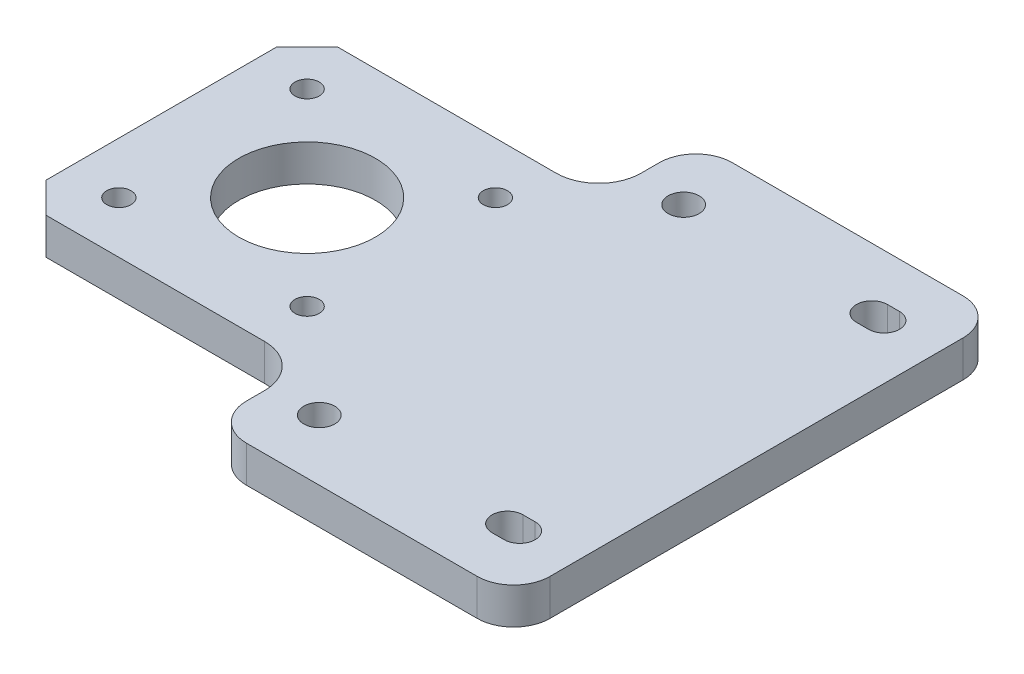
ISO-10303-21;
HEADER;
FILE_DESCRIPTION(('STEP AP214'),'2;1');
FILE_NAME('part.step','',(''),(''),'','','');
FILE_SCHEMA(('AUTOMOTIVE_DESIGN { 1 0 10303 214 1 1 1 1 }'));
ENDSEC;
DATA;
#1=APPLICATION_CONTEXT('core data for automotive mechanical design processes');
#2=APPLICATION_PROTOCOL_DEFINITION('international standard','automotive_design',2000,#1);
#3=PRODUCT_CONTEXT('',#1,'mechanical');
#4=PRODUCT('Part','Part','',(#3));
#5=PRODUCT_RELATED_PRODUCT_CATEGORY('part','',(#4));
#6=PRODUCT_DEFINITION_FORMATION('','',#4);
#7=PRODUCT_DEFINITION_CONTEXT('part definition',#1,'design');
#8=PRODUCT_DEFINITION('design','',#6,#7);
#9=PRODUCT_DEFINITION_SHAPE('','',#8);
#10=(LENGTH_UNIT() NAMED_UNIT(*) SI_UNIT(.MILLI.,.METRE.));
#11=(NAMED_UNIT(*) PLANE_ANGLE_UNIT() SI_UNIT($,.RADIAN.));
#12=(NAMED_UNIT(*) SI_UNIT($,.STERADIAN.) SOLID_ANGLE_UNIT());
#13=UNCERTAINTY_MEASURE_WITH_UNIT(LENGTH_MEASURE(1.E-05),#10,'distance_accuracy_value','');
#14=(GEOMETRIC_REPRESENTATION_CONTEXT(3) GLOBAL_UNCERTAINTY_ASSIGNED_CONTEXT((#13)) GLOBAL_UNIT_ASSIGNED_CONTEXT((#10,
#11,#12)) REPRESENTATION_CONTEXT('',''));
#15=CARTESIAN_POINT('',(0.,0.,0.));
#16=DIRECTION('',(0.,0.,1.));
#17=DIRECTION('',(1.,0.,0.));
#18=AXIS2_PLACEMENT_3D('',#15,#16,#17);
#19=CARTESIAN_POINT('',(19.,6.,-34.));
#20=DIRECTION('',(0.,-1.,0.));
#21=DIRECTION('',(0.,0.,-1.));
#22=AXIS2_PLACEMENT_3D('',#19,#20,#21);
#23=PLANE('',#22);
#24=CARTESIAN_POINT('',(-17.,6.,30.));
#25=DIRECTION('',(0.,-1.,0.));
#26=DIRECTION('',(0.,0.,1.));
#27=AXIS2_PLACEMENT_3D('',#24,#25,#26);
#28=CIRCLE('',#27,2.55);
#29=CARTESIAN_POINT('',(-17.,6.,32.55));
#30=VERTEX_POINT('',#29);
#31=EDGE_CURVE('E250',#30,#30,#28,.T.);
#32=ORIENTED_EDGE('',*,*,#31,.T.);
#33=EDGE_LOOP('',(#32));
#34=FACE_BOUND('',#33,.T.);
#35=DIRECTION('',(1.,0.,0.));
#36=VECTOR('',#35,1.);
#37=CARTESIAN_POINT('',(16.,6.,27.45));
#38=LINE('',#37,#36);
#39=CARTESIAN_POINT('',(14.,6.,27.45));
#40=VERTEX_POINT('',#39);
#41=CARTESIAN_POINT('',(16.,6.,27.45));
#42=VERTEX_POINT('',#41);
#43=EDGE_CURVE('E243',#40,#42,#38,.T.);
#44=ORIENTED_EDGE('',*,*,#43,.T.);
#45=CARTESIAN_POINT('',(16.,6.,30.));
#46=DIRECTION('',(0.,-1.,0.));
#47=DIRECTION('',(0.,0.,1.));
#48=AXIS2_PLACEMENT_3D('',#45,#46,#47);
#49=CIRCLE('',#48,2.55000000000001);
#50=CARTESIAN_POINT('',(16.,6.,32.55));
#51=VERTEX_POINT('',#50);
#52=EDGE_CURVE('E235',#42,#51,#49,.T.);
#53=ORIENTED_EDGE('',*,*,#52,.T.);
#54=DIRECTION('',(-1.,0.,0.));
#55=VECTOR('',#54,1.);
#56=CARTESIAN_POINT('',(16.,6.,32.55));
#57=LINE('',#56,#55);
#58=CARTESIAN_POINT('',(14.,6.,32.55));
#59=VERTEX_POINT('',#58);
#60=EDGE_CURVE('E238',#51,#59,#57,.T.);
#61=ORIENTED_EDGE('',*,*,#60,.T.);
#62=CARTESIAN_POINT('',(14.,6.,30.));
#63=DIRECTION('',(0.,-1.,0.));
#64=DIRECTION('',(0.,0.,1.));
#65=AXIS2_PLACEMENT_3D('',#62,#63,#64);
#66=CIRCLE('',#65,2.55000000000001);
#67=EDGE_CURVE('E48',#59,#40,#66,.T.);
#68=ORIENTED_EDGE('',*,*,#67,.T.);
#69=EDGE_LOOP('',(#44,#53,#61,#68));
#70=FACE_BOUND('',#69,.T.);
#71=DIRECTION('',(1.,0.,0.));
#72=VECTOR('',#71,1.);
#73=CARTESIAN_POINT('',(16.,6.,-32.55));
#74=LINE('',#73,#72);
#75=CARTESIAN_POINT('',(14.,6.,-32.55));
#76=VERTEX_POINT('',#75);
#77=CARTESIAN_POINT('',(16.,6.,-32.55));
#78=VERTEX_POINT('',#77);
#79=EDGE_CURVE('E206',#76,#78,#74,.T.);
#80=ORIENTED_EDGE('',*,*,#79,.T.);
#81=CARTESIAN_POINT('',(16.,6.,-30.));
#82=DIRECTION('',(0.,-1.,0.));
#83=DIRECTION('',(0.,0.,-1.));
#84=AXIS2_PLACEMENT_3D('',#81,#82,#83);
#85=CIRCLE('',#84,2.55000000000001);
#86=CARTESIAN_POINT('',(16.,6.,-27.45));
#87=VERTEX_POINT('',#86);
#88=EDGE_CURVE('E198',#78,#87,#85,.T.);
#89=ORIENTED_EDGE('',*,*,#88,.T.);
#90=DIRECTION('',(-1.,0.,0.));
#91=VECTOR('',#90,1.);
#92=CARTESIAN_POINT('',(16.,6.,-27.45));
#93=LINE('',#92,#91);
#94=CARTESIAN_POINT('',(14.,6.,-27.45));
#95=VERTEX_POINT('',#94);
#96=EDGE_CURVE('E209',#87,#95,#93,.T.);
#97=ORIENTED_EDGE('',*,*,#96,.T.);
#98=CARTESIAN_POINT('',(14.,6.,-30.));
#99=DIRECTION('',(0.,-1.,0.));
#100=DIRECTION('',(0.,0.,-1.));
#101=AXIS2_PLACEMENT_3D('',#98,#99,#100);
#102=CIRCLE('',#101,2.55000000000001);
#103=EDGE_CURVE('E56',#95,#76,#102,.T.);
#104=ORIENTED_EDGE('',*,*,#103,.T.);
#105=EDGE_LOOP('',(#80,#89,#97,#104));
#106=FACE_BOUND('',#105,.T.);
#107=CARTESIAN_POINT('',(-17.,6.,-30.));
#108=DIRECTION('',(0.,-1.,0.));
#109=DIRECTION('',(0.,0.,-1.));
#110=AXIS2_PLACEMENT_3D('',#107,#108,#109);
#111=CIRCLE('',#110,2.55);
#112=CARTESIAN_POINT('',(-17.,6.,-32.55));
#113=VERTEX_POINT('',#112);
#114=EDGE_CURVE('E270',#113,#113,#111,.T.);
#115=ORIENTED_EDGE('',*,*,#114,.T.);
#116=EDGE_LOOP('',(#115));
#117=FACE_BOUND('',#116,.T.);
#118=CARTESIAN_POINT('',(19.,6.,-34.));
#119=DIRECTION('',(0.,1.,0.));
#120=DIRECTION('',(0.,0.,-1.));
#121=AXIS2_PLACEMENT_3D('',#118,#119,#120);
#122=CIRCLE('',#121,6.);
#123=CARTESIAN_POINT('',(25.,6.,-34.));
#124=VERTEX_POINT('',#123);
#125=CARTESIAN_POINT('',(19.,6.,-40.));
#126=VERTEX_POINT('',#125);
#127=EDGE_CURVE('E306',#124,#126,#122,.T.);
#128=ORIENTED_EDGE('',*,*,#127,.T.);
#129=DIRECTION('',(-1.,0.,0.));
#130=VECTOR('',#129,1.);
#131=CARTESIAN_POINT('',(-19.,6.,-40.));
#132=LINE('',#131,#130);
#133=CARTESIAN_POINT('',(-19.,6.,-40.));
#134=VERTEX_POINT('',#133);
#135=EDGE_CURVE('E309',#126,#134,#132,.T.);
#136=ORIENTED_EDGE('',*,*,#135,.T.);
#137=CARTESIAN_POINT('',(-19.,6.,-34.));
#138=DIRECTION('',(0.,1.,0.));
#139=DIRECTION('',(0.,0.,-1.));
#140=AXIS2_PLACEMENT_3D('',#137,#138,#139);
#141=CIRCLE('',#140,6.);
#142=CARTESIAN_POINT('',(-25.,6.,-34.));
#143=VERTEX_POINT('',#142);
#144=EDGE_CURVE('E312',#134,#143,#141,.T.);
#145=ORIENTED_EDGE('',*,*,#144,.T.);
#146=DIRECTION('',(0.,0.,1.));
#147=VECTOR('',#146,1.);
#148=CARTESIAN_POINT('',(-25.,6.,-31.));
#149=LINE('',#148,#147);
#150=CARTESIAN_POINT('',(-25.,6.,-31.));
#151=VERTEX_POINT('',#150);
#152=EDGE_CURVE('E314',#143,#151,#149,.T.);
#153=ORIENTED_EDGE('',*,*,#152,.T.);
#154=CARTESIAN_POINT('',(-32.,6.,-31.));
#155=DIRECTION('',(0.,-1.,0.));
#156=DIRECTION('',(0.,0.,1.));
#157=AXIS2_PLACEMENT_3D('',#154,#155,#156);
#158=CIRCLE('',#157,7.);
#159=CARTESIAN_POINT('',(-32.,6.,-24.));
#160=VERTEX_POINT('',#159);
#161=EDGE_CURVE('E316',#151,#160,#158,.T.);
#162=ORIENTED_EDGE('',*,*,#161,.T.);
#163=DIRECTION('',(-1.,0.,0.));
#164=VECTOR('',#163,1.);
#165=CARTESIAN_POINT('',(-32.,6.,-24.));
#166=LINE('',#165,#164);
#167=CARTESIAN_POINT('',(-68.,6.,-24.));
#168=VERTEX_POINT('',#167);
#169=EDGE_CURVE('E318',#160,#168,#166,.T.);
#170=ORIENTED_EDGE('',*,*,#169,.T.);
#171=DIRECTION('',(-0.707106781186547,0.,0.707106781186548));
#172=VECTOR('',#171,1.);
#173=CARTESIAN_POINT('',(-68.,6.,-24.));
#174=LINE('',#173,#172);
#175=CARTESIAN_POINT('',(-73.,6.,-19.));
#176=VERTEX_POINT('',#175);
#177=EDGE_CURVE('E320',#168,#176,#174,.T.);
#178=ORIENTED_EDGE('',*,*,#177,.T.);
#179=DIRECTION('',(0.,0.,1.));
#180=VECTOR('',#179,1.);
#181=CARTESIAN_POINT('',(-73.,6.,19.));
#182=LINE('',#181,#180);
#183=CARTESIAN_POINT('',(-73.,6.,19.));
#184=VERTEX_POINT('',#183);
#185=EDGE_CURVE('E322',#176,#184,#182,.T.);
#186=ORIENTED_EDGE('',*,*,#185,.T.);
#187=DIRECTION('',(0.707106781186548,0.,0.707106781186547));
#188=VECTOR('',#187,1.);
#189=CARTESIAN_POINT('',(-68.,6.,24.));
#190=LINE('',#189,#188);
#191=CARTESIAN_POINT('',(-68.,6.,24.));
#192=VERTEX_POINT('',#191);
#193=EDGE_CURVE('E324',#184,#192,#190,.T.);
#194=ORIENTED_EDGE('',*,*,#193,.T.);
#195=DIRECTION('',(1.,0.,0.));
#196=VECTOR('',#195,1.);
#197=CARTESIAN_POINT('',(-32.,6.,24.));
#198=LINE('',#197,#196);
#199=CARTESIAN_POINT('',(-32.,6.,24.));
#200=VERTEX_POINT('',#199);
#201=EDGE_CURVE('E326',#192,#200,#198,.T.);
#202=ORIENTED_EDGE('',*,*,#201,.T.);
#203=CARTESIAN_POINT('',(-32.,6.,31.));
#204=DIRECTION('',(0.,-1.,0.));
#205=DIRECTION('',(0.,0.,1.));
#206=AXIS2_PLACEMENT_3D('',#203,#204,#205);
#207=CIRCLE('',#206,7.);
#208=CARTESIAN_POINT('',(-25.,6.,31.));
#209=VERTEX_POINT('',#208);
#210=EDGE_CURVE('E328',#200,#209,#207,.T.);
#211=ORIENTED_EDGE('',*,*,#210,.T.);
#212=DIRECTION('',(0.,0.,1.));
#213=VECTOR('',#212,1.);
#214=CARTESIAN_POINT('',(-25.,6.,34.));
#215=LINE('',#214,#213);
#216=CARTESIAN_POINT('',(-25.,6.,34.));
#217=VERTEX_POINT('',#216);
#218=EDGE_CURVE('E330',#209,#217,#215,.T.);
#219=ORIENTED_EDGE('',*,*,#218,.T.);
#220=CARTESIAN_POINT('',(-19.,6.,34.));
#221=DIRECTION('',(0.,1.,0.));
#222=DIRECTION('',(0.,0.,-1.));
#223=AXIS2_PLACEMENT_3D('',#220,#221,#222);
#224=CIRCLE('',#223,6.);
#225=CARTESIAN_POINT('',(-19.,6.,40.));
#226=VERTEX_POINT('',#225);
#227=EDGE_CURVE('E332',#217,#226,#224,.T.);
#228=ORIENTED_EDGE('',*,*,#227,.T.);
#229=DIRECTION('',(1.,0.,0.));
#230=VECTOR('',#229,1.);
#231=CARTESIAN_POINT('',(-19.,6.,40.));
#232=LINE('',#231,#230);
#233=CARTESIAN_POINT('',(19.,6.,40.));
#234=VERTEX_POINT('',#233);
#235=EDGE_CURVE('E334',#226,#234,#232,.T.);
#236=ORIENTED_EDGE('',*,*,#235,.T.);
#237=CARTESIAN_POINT('',(19.,6.,34.));
#238=DIRECTION('',(0.,1.,0.));
#239=DIRECTION('',(0.,0.,1.));
#240=AXIS2_PLACEMENT_3D('',#237,#238,#239);
#241=CIRCLE('',#240,6.);
#242=CARTESIAN_POINT('',(25.,6.,34.));
#243=VERTEX_POINT('',#242);
#244=EDGE_CURVE('E336',#234,#243,#241,.T.);
#245=ORIENTED_EDGE('',*,*,#244,.T.);
#246=DIRECTION('',(0.,0.,-1.));
#247=VECTOR('',#246,1.);
#248=CARTESIAN_POINT('',(25.,6.,34.));
#249=LINE('',#248,#247);
#250=EDGE_CURVE('E338',#243,#124,#249,.T.);
#251=ORIENTED_EDGE('',*,*,#250,.T.);
#252=EDGE_LOOP('',(#128,#136,#145,#153,#162,#170,#178,#186,#194,#202,#211,#219,#228,#236,#245,#251));
#253=FACE_BOUND('',#252,.T.);
#254=CARTESIAN_POINT('',(-49.,6.,0.));
#255=DIRECTION('',(0.,1.,0.));
#256=DIRECTION('',(0.,0.,1.));
#257=AXIS2_PLACEMENT_3D('',#254,#255,#256);
#258=CIRCLE('',#257,11.25);
#259=CARTESIAN_POINT('',(-49.,6.,11.25));
#260=VERTEX_POINT('',#259);
#261=EDGE_CURVE('E300',#260,#260,#258,.T.);
#262=ORIENTED_EDGE('',*,*,#261,.F.);
#263=EDGE_LOOP('',(#262));
#264=FACE_BOUND('',#263,.T.);
#265=CARTESIAN_POINT('',(-64.5,6.,-15.5));
#266=DIRECTION('',(0.,1.,0.));
#267=DIRECTION('',(0.,0.,1.));
#268=AXIS2_PLACEMENT_3D('',#265,#266,#267);
#269=CIRCLE('',#268,2.);
#270=CARTESIAN_POINT('',(-64.5,6.,-13.5));
#271=VERTEX_POINT('',#270);
#272=EDGE_CURVE('E294',#271,#271,#269,.T.);
#273=ORIENTED_EDGE('',*,*,#272,.F.);
#274=EDGE_LOOP('',(#273));
#275=FACE_BOUND('',#274,.T.);
#276=CARTESIAN_POINT('',(-64.5,6.,15.5));
#277=DIRECTION('',(0.,1.,0.));
#278=DIRECTION('',(0.,0.,-1.));
#279=AXIS2_PLACEMENT_3D('',#276,#277,#278);
#280=CIRCLE('',#279,2.);
#281=CARTESIAN_POINT('',(-64.5,6.,13.5));
#282=VERTEX_POINT('',#281);
#283=EDGE_CURVE('E288',#282,#282,#280,.T.);
#284=ORIENTED_EDGE('',*,*,#283,.F.);
#285=EDGE_LOOP('',(#284));
#286=FACE_BOUND('',#285,.T.);
#287=CARTESIAN_POINT('',(-33.5,6.,-15.5));
#288=DIRECTION('',(0.,1.,0.));
#289=DIRECTION('',(0.,0.,-1.));
#290=AXIS2_PLACEMENT_3D('',#287,#288,#289);
#291=CIRCLE('',#290,2.);
#292=CARTESIAN_POINT('',(-33.5,6.,-17.5));
#293=VERTEX_POINT('',#292);
#294=EDGE_CURVE('E282',#293,#293,#291,.T.);
#295=ORIENTED_EDGE('',*,*,#294,.F.);
#296=EDGE_LOOP('',(#295));
#297=FACE_BOUND('',#296,.T.);
#298=CARTESIAN_POINT('',(-33.5,6.,15.5));
#299=DIRECTION('',(0.,1.,0.));
#300=DIRECTION('',(0.,0.,1.));
#301=AXIS2_PLACEMENT_3D('',#298,#299,#300);
#302=CIRCLE('',#301,2.);
#303=CARTESIAN_POINT('',(-33.5,6.,17.5));
#304=VERTEX_POINT('',#303);
#305=EDGE_CURVE('E276',#304,#304,#302,.T.);
#306=ORIENTED_EDGE('',*,*,#305,.F.);
#307=EDGE_LOOP('',(#306));
#308=FACE_BOUND('',#307,.T.);
#309=ADVANCED_FACE('F33',(#34,#70,#106,#117,#253,#264,#275,#286,#297,#308),#23,.F.);
#310=CARTESIAN_POINT('',(19.,0.,-34.));
#311=DIRECTION('',(0.,-1.,0.));
#312=DIRECTION('',(0.,0.,-1.));
#313=AXIS2_PLACEMENT_3D('',#310,#311,#312);
#314=PLANE('',#313);
#315=CARTESIAN_POINT('',(-17.,0.,30.));
#316=DIRECTION('',(0.,-1.,0.));
#317=DIRECTION('',(0.,0.,1.));
#318=AXIS2_PLACEMENT_3D('',#315,#316,#317);
#319=CIRCLE('',#318,2.55);
#320=CARTESIAN_POINT('',(-17.,0.,32.55));
#321=VERTEX_POINT('',#320);
#322=EDGE_CURVE('E267',#321,#321,#319,.T.);
#323=ORIENTED_EDGE('',*,*,#322,.F.);
#324=EDGE_LOOP('',(#323));
#325=FACE_BOUND('',#324,.T.);
#326=CARTESIAN_POINT('',(16.,0.,30.));
#327=DIRECTION('',(0.,-1.,0.));
#328=DIRECTION('',(0.,0.,1.));
#329=AXIS2_PLACEMENT_3D('',#326,#327,#328);
#330=CIRCLE('',#329,2.55000000000001);
#331=CARTESIAN_POINT('',(16.,0.,27.45));
#332=VERTEX_POINT('',#331);
#333=CARTESIAN_POINT('',(16.,0.,32.55));
#334=VERTEX_POINT('',#333);
#335=EDGE_CURVE('E247',#332,#334,#330,.T.);
#336=ORIENTED_EDGE('',*,*,#335,.F.);
#337=DIRECTION('',(1.,0.,0.));
#338=VECTOR('',#337,1.);
#339=CARTESIAN_POINT('',(16.,0.,27.45));
#340=LINE('',#339,#338);
#341=CARTESIAN_POINT('',(14.,0.,27.45));
#342=VERTEX_POINT('',#341);
#343=EDGE_CURVE('E239',#342,#332,#340,.T.);
#344=ORIENTED_EDGE('',*,*,#343,.F.);
#345=CARTESIAN_POINT('',(14.,0.,30.));
#346=DIRECTION('',(0.,-1.,0.));
#347=DIRECTION('',(0.,0.,1.));
#348=AXIS2_PLACEMENT_3D('',#345,#346,#347);
#349=CIRCLE('',#348,2.55000000000001);
#350=CARTESIAN_POINT('',(14.,0.,32.55));
#351=VERTEX_POINT('',#350);
#352=EDGE_CURVE('E253',#351,#342,#349,.T.);
#353=ORIENTED_EDGE('',*,*,#352,.F.);
#354=DIRECTION('',(-1.,0.,0.));
#355=VECTOR('',#354,1.);
#356=CARTESIAN_POINT('',(16.,0.,32.55));
#357=LINE('',#356,#355);
#358=EDGE_CURVE('E249',#334,#351,#357,.T.);
#359=ORIENTED_EDGE('',*,*,#358,.F.);
#360=EDGE_LOOP('',(#336,#344,#353,#359));
#361=FACE_BOUND('',#360,.T.);
#362=CARTESIAN_POINT('',(16.,0.,-30.));
#363=DIRECTION('',(0.,-1.,0.));
#364=DIRECTION('',(0.,0.,-1.));
#365=AXIS2_PLACEMENT_3D('',#362,#363,#364);
#366=CIRCLE('',#365,2.55000000000001);
#367=CARTESIAN_POINT('',(16.,0.,-32.55));
#368=VERTEX_POINT('',#367);
#369=CARTESIAN_POINT('',(16.,0.,-27.45));
#370=VERTEX_POINT('',#369);
#371=EDGE_CURVE('E201',#368,#370,#366,.T.);
#372=ORIENTED_EDGE('',*,*,#371,.F.);
#373=DIRECTION('',(1.,0.,0.));
#374=VECTOR('',#373,1.);
#375=CARTESIAN_POINT('',(16.,0.,-32.55));
#376=LINE('',#375,#374);
#377=CARTESIAN_POINT('',(14.,0.,-32.55));
#378=VERTEX_POINT('',#377);
#379=EDGE_CURVE('E215',#378,#368,#376,.T.);
#380=ORIENTED_EDGE('',*,*,#379,.F.);
#381=CARTESIAN_POINT('',(14.,0.,-30.));
#382=DIRECTION('',(0.,-1.,0.));
#383=DIRECTION('',(0.,0.,-1.));
#384=AXIS2_PLACEMENT_3D('',#381,#382,#383);
#385=CIRCLE('',#384,2.55000000000001);
#386=CARTESIAN_POINT('',(14.,0.,-27.45));
#387=VERTEX_POINT('',#386);
#388=EDGE_CURVE('E218',#387,#378,#385,.T.);
#389=ORIENTED_EDGE('',*,*,#388,.F.);
#390=DIRECTION('',(-1.,0.,0.));
#391=VECTOR('',#390,1.);
#392=CARTESIAN_POINT('',(16.,0.,-27.45));
#393=LINE('',#392,#391);
#394=EDGE_CURVE('E224',#370,#387,#393,.T.);
#395=ORIENTED_EDGE('',*,*,#394,.F.);
#396=EDGE_LOOP('',(#372,#380,#389,#395));
#397=FACE_BOUND('',#396,.T.);
#398=CARTESIAN_POINT('',(-17.,0.,-30.));
#399=DIRECTION('',(0.,-1.,0.));
#400=DIRECTION('',(0.,0.,-1.));
#401=AXIS2_PLACEMENT_3D('',#398,#399,#400);
#402=CIRCLE('',#401,2.55);
#403=CARTESIAN_POINT('',(-17.,0.,-32.55));
#404=VERTEX_POINT('',#403);
#405=EDGE_CURVE('E231',#404,#404,#402,.T.);
#406=ORIENTED_EDGE('',*,*,#405,.F.);
#407=EDGE_LOOP('',(#406));
#408=FACE_BOUND('',#407,.T.);
#409=CARTESIAN_POINT('',(-33.5,0.,-15.5));
#410=DIRECTION('',(0.,1.,0.));
#411=DIRECTION('',(0.,0.,-1.));
#412=AXIS2_PLACEMENT_3D('',#409,#410,#411);
#413=CIRCLE('',#412,2.);
#414=CARTESIAN_POINT('',(-33.5,0.,-17.5));
#415=VERTEX_POINT('',#414);
#416=EDGE_CURVE('E279',#415,#415,#413,.T.);
#417=ORIENTED_EDGE('',*,*,#416,.T.);
#418=EDGE_LOOP('',(#417));
#419=FACE_BOUND('',#418,.T.);
#420=CARTESIAN_POINT('',(-64.5,0.,-15.5));
#421=DIRECTION('',(0.,1.,0.));
#422=DIRECTION('',(0.,0.,1.));
#423=AXIS2_PLACEMENT_3D('',#420,#421,#422);
#424=CIRCLE('',#423,2.);
#425=CARTESIAN_POINT('',(-64.5,0.,-13.5));
#426=VERTEX_POINT('',#425);
#427=EDGE_CURVE('E291',#426,#426,#424,.T.);
#428=ORIENTED_EDGE('',*,*,#427,.T.);
#429=EDGE_LOOP('',(#428));
#430=FACE_BOUND('',#429,.T.);
#431=CARTESIAN_POINT('',(19.,0.,-34.));
#432=DIRECTION('',(0.,1.,0.));
#433=DIRECTION('',(0.,0.,-1.));
#434=AXIS2_PLACEMENT_3D('',#431,#432,#433);
#435=CIRCLE('',#434,6.);
#436=CARTESIAN_POINT('',(25.,0.,-34.));
#437=VERTEX_POINT('',#436);
#438=CARTESIAN_POINT('',(19.,0.,-40.));
#439=VERTEX_POINT('',#438);
#440=EDGE_CURVE('E303',#437,#439,#435,.T.);
#441=ORIENTED_EDGE('',*,*,#440,.F.);
#442=DIRECTION('',(0.,0.,-1.));
#443=VECTOR('',#442,1.);
#444=CARTESIAN_POINT('',(25.,0.,34.));
#445=LINE('',#444,#443);
#446=CARTESIAN_POINT('',(25.,0.,34.));
#447=VERTEX_POINT('',#446);
#448=EDGE_CURVE('E310',#447,#437,#445,.T.);
#449=ORIENTED_EDGE('',*,*,#448,.F.);
#450=CARTESIAN_POINT('',(19.,0.,34.));
#451=DIRECTION('',(0.,1.,0.));
#452=DIRECTION('',(0.,0.,1.));
#453=AXIS2_PLACEMENT_3D('',#450,#451,#452);
#454=CIRCLE('',#453,6.);
#455=CARTESIAN_POINT('',(19.,0.,40.));
#456=VERTEX_POINT('',#455);
#457=EDGE_CURVE('E369',#456,#447,#454,.T.);
#458=ORIENTED_EDGE('',*,*,#457,.F.);
#459=DIRECTION('',(1.,0.,0.));
#460=VECTOR('',#459,1.);
#461=CARTESIAN_POINT('',(-19.,0.,40.));
#462=LINE('',#461,#460);
#463=CARTESIAN_POINT('',(-19.,0.,40.));
#464=VERTEX_POINT('',#463);
#465=EDGE_CURVE('E367',#464,#456,#462,.T.);
#466=ORIENTED_EDGE('',*,*,#465,.F.);
#467=CARTESIAN_POINT('',(-19.,0.,34.));
#468=DIRECTION('',(0.,1.,0.));
#469=DIRECTION('',(0.,0.,-1.));
#470=AXIS2_PLACEMENT_3D('',#467,#468,#469);
#471=CIRCLE('',#470,6.);
#472=CARTESIAN_POINT('',(-25.,0.,34.));
#473=VERTEX_POINT('',#472);
#474=EDGE_CURVE('E365',#473,#464,#471,.T.);
#475=ORIENTED_EDGE('',*,*,#474,.F.);
#476=DIRECTION('',(0.,0.,1.));
#477=VECTOR('',#476,1.);
#478=CARTESIAN_POINT('',(-25.,0.,34.));
#479=LINE('',#478,#477);
#480=CARTESIAN_POINT('',(-25.,0.,31.));
#481=VERTEX_POINT('',#480);
#482=EDGE_CURVE('E363',#481,#473,#479,.T.);
#483=ORIENTED_EDGE('',*,*,#482,.F.);
#484=CARTESIAN_POINT('',(-32.,0.,31.));
#485=DIRECTION('',(0.,-1.,0.));
#486=DIRECTION('',(0.,0.,1.));
#487=AXIS2_PLACEMENT_3D('',#484,#485,#486);
#488=CIRCLE('',#487,7.);
#489=CARTESIAN_POINT('',(-32.,0.,24.));
#490=VERTEX_POINT('',#489);
#491=EDGE_CURVE('E361',#490,#481,#488,.T.);
#492=ORIENTED_EDGE('',*,*,#491,.F.);
#493=DIRECTION('',(1.,0.,0.));
#494=VECTOR('',#493,1.);
#495=CARTESIAN_POINT('',(-32.,0.,24.));
#496=LINE('',#495,#494);
#497=CARTESIAN_POINT('',(-68.,0.,24.));
#498=VERTEX_POINT('',#497);
#499=EDGE_CURVE('E359',#498,#490,#496,.T.);
#500=ORIENTED_EDGE('',*,*,#499,.F.);
#501=DIRECTION('',(0.707106781186548,0.,0.707106781186547));
#502=VECTOR('',#501,1.);
#503=CARTESIAN_POINT('',(-68.,0.,24.));
#504=LINE('',#503,#502);
#505=CARTESIAN_POINT('',(-73.,0.,19.));
#506=VERTEX_POINT('',#505);
#507=EDGE_CURVE('E357',#506,#498,#504,.T.);
#508=ORIENTED_EDGE('',*,*,#507,.F.);
#509=DIRECTION('',(0.,0.,1.));
#510=VECTOR('',#509,1.);
#511=CARTESIAN_POINT('',(-73.,0.,19.));
#512=LINE('',#511,#510);
#513=CARTESIAN_POINT('',(-73.,0.,-19.));
#514=VERTEX_POINT('',#513);
#515=EDGE_CURVE('E355',#514,#506,#512,.T.);
#516=ORIENTED_EDGE('',*,*,#515,.F.);
#517=DIRECTION('',(-0.707106781186547,0.,0.707106781186548));
#518=VECTOR('',#517,1.);
#519=CARTESIAN_POINT('',(-68.,0.,-24.));
#520=LINE('',#519,#518);
#521=CARTESIAN_POINT('',(-68.,0.,-24.));
#522=VERTEX_POINT('',#521);
#523=EDGE_CURVE('E353',#522,#514,#520,.T.);
#524=ORIENTED_EDGE('',*,*,#523,.F.);
#525=DIRECTION('',(-1.,0.,0.));
#526=VECTOR('',#525,1.);
#527=CARTESIAN_POINT('',(-32.,0.,-24.));
#528=LINE('',#527,#526);
#529=CARTESIAN_POINT('',(-32.,0.,-24.));
#530=VERTEX_POINT('',#529);
#531=EDGE_CURVE('E351',#530,#522,#528,.T.);
#532=ORIENTED_EDGE('',*,*,#531,.F.);
#533=CARTESIAN_POINT('',(-32.,0.,-31.));
#534=DIRECTION('',(0.,-1.,0.));
#535=DIRECTION('',(0.,0.,1.));
#536=AXIS2_PLACEMENT_3D('',#533,#534,#535);
#537=CIRCLE('',#536,7.);
#538=CARTESIAN_POINT('',(-25.,0.,-31.));
#539=VERTEX_POINT('',#538);
#540=EDGE_CURVE('E349',#539,#530,#537,.T.);
#541=ORIENTED_EDGE('',*,*,#540,.F.);
#542=DIRECTION('',(0.,0.,1.));
#543=VECTOR('',#542,1.);
#544=CARTESIAN_POINT('',(-25.,0.,-31.));
#545=LINE('',#544,#543);
#546=CARTESIAN_POINT('',(-25.,0.,-34.));
#547=VERTEX_POINT('',#546);
#548=EDGE_CURVE('E347',#547,#539,#545,.T.);
#549=ORIENTED_EDGE('',*,*,#548,.F.);
#550=CARTESIAN_POINT('',(-19.,0.,-34.));
#551=DIRECTION('',(0.,1.,0.));
#552=DIRECTION('',(0.,0.,-1.));
#553=AXIS2_PLACEMENT_3D('',#550,#551,#552);
#554=CIRCLE('',#553,6.);
#555=CARTESIAN_POINT('',(-19.,0.,-40.));
#556=VERTEX_POINT('',#555);
#557=EDGE_CURVE('E345',#556,#547,#554,.T.);
#558=ORIENTED_EDGE('',*,*,#557,.F.);
#559=DIRECTION('',(-1.,0.,0.));
#560=VECTOR('',#559,1.);
#561=CARTESIAN_POINT('',(-19.,0.,-40.));
#562=LINE('',#561,#560);
#563=EDGE_CURVE('E343',#439,#556,#562,.T.);
#564=ORIENTED_EDGE('',*,*,#563,.F.);
#565=EDGE_LOOP('',(#441,#449,#458,#466,#475,#483,#492,#500,#508,#516,#524,#532,#541,#549,#558,#564));
#566=FACE_BOUND('',#565,.T.);
#567=CARTESIAN_POINT('',(-49.,0.,0.));
#568=DIRECTION('',(0.,1.,0.));
#569=DIRECTION('',(0.,0.,1.));
#570=AXIS2_PLACEMENT_3D('',#567,#568,#569);
#571=CIRCLE('',#570,11.25);
#572=CARTESIAN_POINT('',(-49.,0.,11.25));
#573=VERTEX_POINT('',#572);
#574=EDGE_CURVE('E297',#573,#573,#571,.T.);
#575=ORIENTED_EDGE('',*,*,#574,.T.);
#576=EDGE_LOOP('',(#575));
#577=FACE_BOUND('',#576,.T.);
#578=CARTESIAN_POINT('',(-64.5,0.,15.5));
#579=DIRECTION('',(0.,1.,0.));
#580=DIRECTION('',(0.,0.,-1.));
#581=AXIS2_PLACEMENT_3D('',#578,#579,#580);
#582=CIRCLE('',#581,2.);
#583=CARTESIAN_POINT('',(-64.5,0.,13.5));
#584=VERTEX_POINT('',#583);
#585=EDGE_CURVE('E285',#584,#584,#582,.T.);
#586=ORIENTED_EDGE('',*,*,#585,.T.);
#587=EDGE_LOOP('',(#586));
#588=FACE_BOUND('',#587,.T.);
#589=CARTESIAN_POINT('',(-33.5,0.,15.5));
#590=DIRECTION('',(0.,1.,0.));
#591=DIRECTION('',(0.,0.,1.));
#592=AXIS2_PLACEMENT_3D('',#589,#590,#591);
#593=CIRCLE('',#592,2.);
#594=CARTESIAN_POINT('',(-33.5,0.,17.5));
#595=VERTEX_POINT('',#594);
#596=EDGE_CURVE('E273',#595,#595,#593,.T.);
#597=ORIENTED_EDGE('',*,*,#596,.T.);
#598=EDGE_LOOP('',(#597));
#599=FACE_BOUND('',#598,.T.);
#600=ADVANCED_FACE('F423',(#325,#361,#397,#408,#419,#430,#566,#577,#588,#599),#314,.T.);
#601=CARTESIAN_POINT('',(19.,6.,-34.));
#602=DIRECTION('',(0.,-1.,0.));
#603=DIRECTION('',(0.,0.,-1.));
#604=AXIS2_PLACEMENT_3D('',#601,#602,#603);
#605=CYLINDRICAL_SURFACE('',#604,6.);
#606=ORIENTED_EDGE('',*,*,#440,.T.);
#607=DIRECTION('',(0.,-1.,0.));
#608=VECTOR('',#607,1.);
#609=CARTESIAN_POINT('',(19.,6.,-40.));
#610=LINE('',#609,#608);
#611=EDGE_CURVE('E11',#126,#439,#610,.T.);
#612=ORIENTED_EDGE('',*,*,#611,.F.);
#613=ORIENTED_EDGE('',*,*,#127,.F.);
#614=DIRECTION('',(0.,-1.,0.));
#615=VECTOR('',#614,1.);
#616=CARTESIAN_POINT('',(25.,6.,-34.));
#617=LINE('',#616,#615);
#618=EDGE_CURVE('E340',#124,#437,#617,.T.);
#619=ORIENTED_EDGE('',*,*,#618,.T.);
#620=EDGE_LOOP('',(#606,#612,#613,#619));
#621=FACE_BOUND('',#620,.T.);
#622=ADVANCED_FACE('F35',(#621),#605,.T.);
#623=CARTESIAN_POINT('',(-19.,6.,-40.));
#624=DIRECTION('',(0.,0.,1.));
#625=DIRECTION('',(1.,0.,0.));
#626=AXIS2_PLACEMENT_3D('',#623,#624,#625);
#627=PLANE('',#626);
#628=ORIENTED_EDGE('',*,*,#563,.T.);
#629=DIRECTION('',(0.,-1.,0.));
#630=VECTOR('',#629,1.);
#631=CARTESIAN_POINT('',(-19.,6.,-40.));
#632=LINE('',#631,#630);
#633=EDGE_CURVE('E41',#134,#556,#632,.T.);
#634=ORIENTED_EDGE('',*,*,#633,.F.);
#635=ORIENTED_EDGE('',*,*,#135,.F.);
#636=ORIENTED_EDGE('',*,*,#611,.T.);
#637=EDGE_LOOP('',(#628,#634,#635,#636));
#638=FACE_BOUND('',#637,.T.);
#639=ADVANCED_FACE('F441',(#638),#627,.F.);
#640=CARTESIAN_POINT('',(-19.,6.,-34.));
#641=DIRECTION('',(0.,-1.,0.));
#642=DIRECTION('',(0.,0.,-1.));
#643=AXIS2_PLACEMENT_3D('',#640,#641,#642);
#644=CYLINDRICAL_SURFACE('',#643,6.);
#645=ORIENTED_EDGE('',*,*,#557,.T.);
#646=DIRECTION('',(0.,-1.,0.));
#647=VECTOR('',#646,1.);
#648=CARTESIAN_POINT('',(-25.,6.,-34.));
#649=LINE('',#648,#647);
#650=EDGE_CURVE('E410',#143,#547,#649,.T.);
#651=ORIENTED_EDGE('',*,*,#650,.F.);
#652=ORIENTED_EDGE('',*,*,#144,.F.);
#653=ORIENTED_EDGE('',*,*,#633,.T.);
#654=EDGE_LOOP('',(#645,#651,#652,#653));
#655=FACE_BOUND('',#654,.T.);
#656=ADVANCED_FACE('F417',(#655),#644,.T.);
#657=CARTESIAN_POINT('',(-25.,6.,-31.));
#658=DIRECTION('',(1.,0.,0.));
#659=DIRECTION('',(0.,0.,-1.));
#660=AXIS2_PLACEMENT_3D('',#657,#658,#659);
#661=PLANE('',#660);
#662=ORIENTED_EDGE('',*,*,#548,.T.);
#663=DIRECTION('',(0.,-1.,0.));
#664=VECTOR('',#663,1.);
#665=CARTESIAN_POINT('',(-25.,6.,-31.));
#666=LINE('',#665,#664);
#667=EDGE_CURVE('E407',#151,#539,#666,.T.);
#668=ORIENTED_EDGE('',*,*,#667,.F.);
#669=ORIENTED_EDGE('',*,*,#152,.F.);
#670=ORIENTED_EDGE('',*,*,#650,.T.);
#671=EDGE_LOOP('',(#662,#668,#669,#670));
#672=FACE_BOUND('',#671,.T.);
#673=ADVANCED_FACE('F429',(#672),#661,.F.);
#674=CARTESIAN_POINT('',(-32.,6.,-31.));
#675=DIRECTION('',(0.,-1.,0.));
#676=DIRECTION('',(0.,0.,-1.));
#677=AXIS2_PLACEMENT_3D('',#674,#675,#676);
#678=CYLINDRICAL_SURFACE('',#677,7.);
#679=ORIENTED_EDGE('',*,*,#540,.T.);
#680=DIRECTION('',(0.,-1.,0.));
#681=VECTOR('',#680,1.);
#682=CARTESIAN_POINT('',(-32.,6.,-24.));
#683=LINE('',#682,#681);
#684=EDGE_CURVE('E404',#160,#530,#683,.T.);
#685=ORIENTED_EDGE('',*,*,#684,.F.);
#686=ORIENTED_EDGE('',*,*,#161,.F.);
#687=ORIENTED_EDGE('',*,*,#667,.T.);
#688=EDGE_LOOP('',(#679,#685,#686,#687));
#689=FACE_BOUND('',#688,.T.);
#690=ADVANCED_FACE('F433',(#689),#678,.F.);
#691=CARTESIAN_POINT('',(-32.,6.,-24.));
#692=DIRECTION('',(0.,0.,1.));
#693=DIRECTION('',(1.,0.,0.));
#694=AXIS2_PLACEMENT_3D('',#691,#692,#693);
#695=PLANE('',#694);
#696=ORIENTED_EDGE('',*,*,#531,.T.);
#697=DIRECTION('',(0.,-1.,0.));
#698=VECTOR('',#697,1.);
#699=CARTESIAN_POINT('',(-68.,6.,-24.));
#700=LINE('',#699,#698);
#701=EDGE_CURVE('E401',#168,#522,#700,.T.);
#702=ORIENTED_EDGE('',*,*,#701,.F.);
#703=ORIENTED_EDGE('',*,*,#169,.F.);
#704=ORIENTED_EDGE('',*,*,#684,.T.);
#705=EDGE_LOOP('',(#696,#702,#703,#704));
#706=FACE_BOUND('',#705,.T.);
#707=ADVANCED_FACE('F494',(#706),#695,.F.);
#708=CARTESIAN_POINT('',(-68.,6.,-24.));
#709=DIRECTION('',(0.707106781186548,0.,0.707106781186547));
#710=DIRECTION('',(0.707106781186547,0.,-0.707106781186548));
#711=AXIS2_PLACEMENT_3D('',#708,#709,#710);
#712=PLANE('',#711);
#713=ORIENTED_EDGE('',*,*,#523,.T.);
#714=DIRECTION('',(0.,-1.,0.));
#715=VECTOR('',#714,1.);
#716=CARTESIAN_POINT('',(-73.,6.,-19.));
#717=LINE('',#716,#715);
#718=EDGE_CURVE('E398',#176,#514,#717,.T.);
#719=ORIENTED_EDGE('',*,*,#718,.F.);
#720=ORIENTED_EDGE('',*,*,#177,.F.);
#721=ORIENTED_EDGE('',*,*,#701,.T.);
#722=EDGE_LOOP('',(#713,#719,#720,#721));
#723=FACE_BOUND('',#722,.T.);
#724=ADVANCED_FACE('F491',(#723),#712,.F.);
#725=CARTESIAN_POINT('',(-73.,6.,19.));
#726=DIRECTION('',(1.,0.,0.));
#727=DIRECTION('',(0.,0.,-1.));
#728=AXIS2_PLACEMENT_3D('',#725,#726,#727);
#729=PLANE('',#728);
#730=ORIENTED_EDGE('',*,*,#515,.T.);
#731=DIRECTION('',(0.,-1.,0.));
#732=VECTOR('',#731,1.);
#733=CARTESIAN_POINT('',(-73.,6.,19.));
#734=LINE('',#733,#732);
#735=EDGE_CURVE('E395',#184,#506,#734,.T.);
#736=ORIENTED_EDGE('',*,*,#735,.F.);
#737=ORIENTED_EDGE('',*,*,#185,.F.);
#738=ORIENTED_EDGE('',*,*,#718,.T.);
#739=EDGE_LOOP('',(#730,#736,#737,#738));
#740=FACE_BOUND('',#739,.T.);
#741=ADVANCED_FACE('F487',(#740),#729,.F.);
#742=CARTESIAN_POINT('',(-68.,6.,24.));
#743=DIRECTION('',(0.707106781186547,0.,-0.707106781186548));
#744=DIRECTION('',(-0.707106781186548,0.,-0.707106781186547));
#745=AXIS2_PLACEMENT_3D('',#742,#743,#744);
#746=PLANE('',#745);
#747=ORIENTED_EDGE('',*,*,#507,.T.);
#748=DIRECTION('',(0.,-1.,0.));
#749=VECTOR('',#748,1.);
#750=CARTESIAN_POINT('',(-68.,6.,24.));
#751=LINE('',#750,#749);
#752=EDGE_CURVE('E392',#192,#498,#751,.T.);
#753=ORIENTED_EDGE('',*,*,#752,.F.);
#754=ORIENTED_EDGE('',*,*,#193,.F.);
#755=ORIENTED_EDGE('',*,*,#735,.T.);
#756=EDGE_LOOP('',(#747,#753,#754,#755));
#757=FACE_BOUND('',#756,.T.);
#758=ADVANCED_FACE('F483',(#757),#746,.F.);
#759=CARTESIAN_POINT('',(-32.,6.,24.));
#760=DIRECTION('',(0.,0.,-1.));
#761=DIRECTION('',(-1.,0.,0.));
#762=AXIS2_PLACEMENT_3D('',#759,#760,#761);
#763=PLANE('',#762);
#764=ORIENTED_EDGE('',*,*,#499,.T.);
#765=DIRECTION('',(0.,-1.,0.));
#766=VECTOR('',#765,1.);
#767=CARTESIAN_POINT('',(-32.,6.,24.));
#768=LINE('',#767,#766);
#769=EDGE_CURVE('E389',#200,#490,#768,.T.);
#770=ORIENTED_EDGE('',*,*,#769,.F.);
#771=ORIENTED_EDGE('',*,*,#201,.F.);
#772=ORIENTED_EDGE('',*,*,#752,.T.);
#773=EDGE_LOOP('',(#764,#770,#771,#772));
#774=FACE_BOUND('',#773,.T.);
#775=ADVANCED_FACE('F478',(#774),#763,.F.);
#776=CARTESIAN_POINT('',(-32.,6.,31.));
#777=DIRECTION('',(0.,-1.,0.));
#778=DIRECTION('',(0.,0.,-1.));
#779=AXIS2_PLACEMENT_3D('',#776,#777,#778);
#780=CYLINDRICAL_SURFACE('',#779,7.);
#781=ORIENTED_EDGE('',*,*,#491,.T.);
#782=DIRECTION('',(0.,-1.,0.));
#783=VECTOR('',#782,1.);
#784=CARTESIAN_POINT('',(-25.,6.,31.));
#785=LINE('',#784,#783);
#786=EDGE_CURVE('E386',#209,#481,#785,.T.);
#787=ORIENTED_EDGE('',*,*,#786,.F.);
#788=ORIENTED_EDGE('',*,*,#210,.F.);
#789=ORIENTED_EDGE('',*,*,#769,.T.);
#790=EDGE_LOOP('',(#781,#787,#788,#789));
#791=FACE_BOUND('',#790,.T.);
#792=ADVANCED_FACE('F472',(#791),#780,.F.);
#793=CARTESIAN_POINT('',(-25.,6.,34.));
#794=DIRECTION('',(1.,0.,0.));
#795=DIRECTION('',(0.,0.,-1.));
#796=AXIS2_PLACEMENT_3D('',#793,#794,#795);
#797=PLANE('',#796);
#798=ORIENTED_EDGE('',*,*,#482,.T.);
#799=DIRECTION('',(0.,-1.,0.));
#800=VECTOR('',#799,1.);
#801=CARTESIAN_POINT('',(-25.,6.,34.));
#802=LINE('',#801,#800);
#803=EDGE_CURVE('E383',#217,#473,#802,.T.);
#804=ORIENTED_EDGE('',*,*,#803,.F.);
#805=ORIENTED_EDGE('',*,*,#218,.F.);
#806=ORIENTED_EDGE('',*,*,#786,.T.);
#807=EDGE_LOOP('',(#798,#804,#805,#806));
#808=FACE_BOUND('',#807,.T.);
#809=ADVANCED_FACE('F468',(#808),#797,.F.);
#810=CARTESIAN_POINT('',(-19.,6.,34.));
#811=DIRECTION('',(0.,-1.,0.));
#812=DIRECTION('',(0.,0.,-1.));
#813=AXIS2_PLACEMENT_3D('',#810,#811,#812);
#814=CYLINDRICAL_SURFACE('',#813,6.);
#815=ORIENTED_EDGE('',*,*,#474,.T.);
#816=DIRECTION('',(0.,-1.,0.));
#817=VECTOR('',#816,1.);
#818=CARTESIAN_POINT('',(-19.,6.,40.));
#819=LINE('',#818,#817);
#820=EDGE_CURVE('E380',#226,#464,#819,.T.);
#821=ORIENTED_EDGE('',*,*,#820,.F.);
#822=ORIENTED_EDGE('',*,*,#227,.F.);
#823=ORIENTED_EDGE('',*,*,#803,.T.);
#824=EDGE_LOOP('',(#815,#821,#822,#823));
#825=FACE_BOUND('',#824,.T.);
#826=ADVANCED_FACE('F463',(#825),#814,.T.);
#827=CARTESIAN_POINT('',(-19.,6.,40.));
#828=DIRECTION('',(0.,0.,-1.));
#829=DIRECTION('',(-1.,0.,0.));
#830=AXIS2_PLACEMENT_3D('',#827,#828,#829);
#831=PLANE('',#830);
#832=ORIENTED_EDGE('',*,*,#465,.T.);
#833=DIRECTION('',(0.,-1.,0.));
#834=VECTOR('',#833,1.);
#835=CARTESIAN_POINT('',(19.,6.,40.));
#836=LINE('',#835,#834);
#837=EDGE_CURVE('E377',#234,#456,#836,.T.);
#838=ORIENTED_EDGE('',*,*,#837,.F.);
#839=ORIENTED_EDGE('',*,*,#235,.F.);
#840=ORIENTED_EDGE('',*,*,#820,.T.);
#841=EDGE_LOOP('',(#832,#838,#839,#840));
#842=FACE_BOUND('',#841,.T.);
#843=ADVANCED_FACE('F457',(#842),#831,.F.);
#844=CARTESIAN_POINT('',(19.,6.,34.));
#845=DIRECTION('',(0.,-1.,0.));
#846=DIRECTION('',(0.,0.,-1.));
#847=AXIS2_PLACEMENT_3D('',#844,#845,#846);
#848=CYLINDRICAL_SURFACE('',#847,6.);
#849=ORIENTED_EDGE('',*,*,#457,.T.);
#850=DIRECTION('',(0.,-1.,0.));
#851=VECTOR('',#850,1.);
#852=CARTESIAN_POINT('',(25.,6.,34.));
#853=LINE('',#852,#851);
#854=EDGE_CURVE('E374',#243,#447,#853,.T.);
#855=ORIENTED_EDGE('',*,*,#854,.F.);
#856=ORIENTED_EDGE('',*,*,#244,.F.);
#857=ORIENTED_EDGE('',*,*,#837,.T.);
#858=EDGE_LOOP('',(#849,#855,#856,#857));
#859=FACE_BOUND('',#858,.T.);
#860=ADVANCED_FACE('F453',(#859),#848,.T.);
#861=CARTESIAN_POINT('',(25.,6.,34.));
#862=DIRECTION('',(-1.,0.,0.));
#863=DIRECTION('',(0.,0.,1.));
#864=AXIS2_PLACEMENT_3D('',#861,#862,#863);
#865=PLANE('',#864);
#866=ORIENTED_EDGE('',*,*,#448,.T.);
#867=ORIENTED_EDGE('',*,*,#618,.F.);
#868=ORIENTED_EDGE('',*,*,#250,.F.);
#869=ORIENTED_EDGE('',*,*,#854,.T.);
#870=EDGE_LOOP('',(#866,#867,#868,#869));
#871=FACE_BOUND('',#870,.T.);
#872=ADVANCED_FACE('F448',(#871),#865,.F.);
#873=CARTESIAN_POINT('',(-49.,6.,0.));
#874=DIRECTION('',(0.,-1.,0.));
#875=DIRECTION('',(0.,0.,-1.));
#876=AXIS2_PLACEMENT_3D('',#873,#874,#875);
#877=CYLINDRICAL_SURFACE('',#876,11.25);
#878=ORIENTED_EDGE('',*,*,#261,.T.);
#879=EDGE_LOOP('',(#878));
#880=FACE_BOUND('',#879,.T.);
#881=ORIENTED_EDGE('',*,*,#574,.F.);
#882=EDGE_LOOP('',(#881));
#883=FACE_BOUND('',#882,.T.);
#884=ADVANCED_FACE('F513',(#880,#883),#877,.F.);
#885=CARTESIAN_POINT('',(-64.5,6.,-15.5));
#886=DIRECTION('',(0.,-1.,0.));
#887=DIRECTION('',(0.,0.,-1.));
#888=AXIS2_PLACEMENT_3D('',#885,#886,#887);
#889=CYLINDRICAL_SURFACE('',#888,2.);
#890=ORIENTED_EDGE('',*,*,#272,.T.);
#891=EDGE_LOOP('',(#890));
#892=FACE_BOUND('',#891,.T.);
#893=ORIENTED_EDGE('',*,*,#427,.F.);
#894=EDGE_LOOP('',(#893));
#895=FACE_BOUND('',#894,.T.);
#896=ADVANCED_FACE('F575',(#892,#895),#889,.F.);
#897=CARTESIAN_POINT('',(-64.5,6.,15.5));
#898=DIRECTION('',(0.,-1.,0.));
#899=DIRECTION('',(0.,0.,-1.));
#900=AXIS2_PLACEMENT_3D('',#897,#898,#899);
#901=CYLINDRICAL_SURFACE('',#900,2.);
#902=ORIENTED_EDGE('',*,*,#283,.T.);
#903=EDGE_LOOP('',(#902));
#904=FACE_BOUND('',#903,.T.);
#905=ORIENTED_EDGE('',*,*,#585,.F.);
#906=EDGE_LOOP('',(#905));
#907=FACE_BOUND('',#906,.T.);
#908=ADVANCED_FACE('F582',(#904,#907),#901,.F.);
#909=CARTESIAN_POINT('',(-33.5,6.,-15.5));
#910=DIRECTION('',(0.,-1.,0.));
#911=DIRECTION('',(0.,0.,-1.));
#912=AXIS2_PLACEMENT_3D('',#909,#910,#911);
#913=CYLINDRICAL_SURFACE('',#912,2.);
#914=ORIENTED_EDGE('',*,*,#294,.T.);
#915=EDGE_LOOP('',(#914));
#916=FACE_BOUND('',#915,.T.);
#917=ORIENTED_EDGE('',*,*,#416,.F.);
#918=EDGE_LOOP('',(#917));
#919=FACE_BOUND('',#918,.T.);
#920=ADVANCED_FACE('F589',(#916,#919),#913,.F.);
#921=CARTESIAN_POINT('',(-33.5,6.,15.5));
#922=DIRECTION('',(0.,-1.,0.));
#923=DIRECTION('',(0.,0.,-1.));
#924=AXIS2_PLACEMENT_3D('',#921,#922,#923);
#925=CYLINDRICAL_SURFACE('',#924,2.);
#926=ORIENTED_EDGE('',*,*,#305,.T.);
#927=EDGE_LOOP('',(#926));
#928=FACE_BOUND('',#927,.T.);
#929=ORIENTED_EDGE('',*,*,#596,.F.);
#930=EDGE_LOOP('',(#929));
#931=FACE_BOUND('',#930,.T.);
#932=ADVANCED_FACE('F597',(#928,#931),#925,.F.);
#933=CARTESIAN_POINT('',(-17.,6.,-30.));
#934=DIRECTION('',(0.,-1.,0.));
#935=DIRECTION('',(0.,0.,-1.));
#936=AXIS2_PLACEMENT_3D('',#933,#934,#935);
#937=CYLINDRICAL_SURFACE('',#936,2.55);
#938=ORIENTED_EDGE('',*,*,#114,.F.);
#939=EDGE_LOOP('',(#938));
#940=FACE_BOUND('',#939,.T.);
#941=ORIENTED_EDGE('',*,*,#405,.T.);
#942=EDGE_LOOP('',(#941));
#943=FACE_BOUND('',#942,.T.);
#944=ADVANCED_FACE('F605',(#940,#943),#937,.F.);
#945=CARTESIAN_POINT('',(16.,6.,-30.));
#946=DIRECTION('',(0.,-1.,0.));
#947=DIRECTION('',(0.,0.,-1.));
#948=AXIS2_PLACEMENT_3D('',#945,#946,#947);
#949=CYLINDRICAL_SURFACE('',#948,2.55000000000001);
#950=ORIENTED_EDGE('',*,*,#371,.T.);
#951=DIRECTION('',(0.,-1.,0.));
#952=VECTOR('',#951,1.);
#953=CARTESIAN_POINT('',(16.,6.,-27.45));
#954=LINE('',#953,#952);
#955=EDGE_CURVE('E194',#87,#370,#954,.T.);
#956=ORIENTED_EDGE('',*,*,#955,.F.);
#957=ORIENTED_EDGE('',*,*,#88,.F.);
#958=DIRECTION('',(0.,-1.,0.));
#959=VECTOR('',#958,1.);
#960=CARTESIAN_POINT('',(16.,6.,-32.55));
#961=LINE('',#960,#959);
#962=EDGE_CURVE('E229',#78,#368,#961,.T.);
#963=ORIENTED_EDGE('',*,*,#962,.T.);
#964=EDGE_LOOP('',(#950,#956,#957,#963));
#965=FACE_BOUND('',#964,.T.);
#966=ADVANCED_FACE('F196',(#965),#949,.F.);
#967=CARTESIAN_POINT('',(16.,6.,-32.55));
#968=DIRECTION('',(0.,0.,-1.));
#969=DIRECTION('',(-1.,0.,0.));
#970=AXIS2_PLACEMENT_3D('',#967,#968,#969);
#971=PLANE('',#970);
#972=ORIENTED_EDGE('',*,*,#379,.T.);
#973=ORIENTED_EDGE('',*,*,#962,.F.);
#974=ORIENTED_EDGE('',*,*,#79,.F.);
#975=DIRECTION('',(0.,-1.,0.));
#976=VECTOR('',#975,1.);
#977=CARTESIAN_POINT('',(14.,6.,-32.55));
#978=LINE('',#977,#976);
#979=EDGE_CURVE('E232',#76,#378,#978,.T.);
#980=ORIENTED_EDGE('',*,*,#979,.T.);
#981=EDGE_LOOP('',(#972,#973,#974,#980));
#982=FACE_BOUND('',#981,.T.);
#983=ADVANCED_FACE('F621',(#982),#971,.F.);
#984=CARTESIAN_POINT('',(14.,6.,-30.));
#985=DIRECTION('',(0.,-1.,0.));
#986=DIRECTION('',(0.,0.,-1.));
#987=AXIS2_PLACEMENT_3D('',#984,#985,#986);
#988=CYLINDRICAL_SURFACE('',#987,2.55000000000001);
#989=ORIENTED_EDGE('',*,*,#388,.T.);
#990=ORIENTED_EDGE('',*,*,#979,.F.);
#991=ORIENTED_EDGE('',*,*,#103,.F.);
#992=DIRECTION('',(0.,-1.,0.));
#993=VECTOR('',#992,1.);
#994=CARTESIAN_POINT('',(14.,6.,-27.45));
#995=LINE('',#994,#993);
#996=EDGE_CURVE('E205',#95,#387,#995,.T.);
#997=ORIENTED_EDGE('',*,*,#996,.T.);
#998=EDGE_LOOP('',(#989,#990,#991,#997));
#999=FACE_BOUND('',#998,.T.);
#1000=ADVANCED_FACE('F628',(#999),#988,.F.);
#1001=CARTESIAN_POINT('',(16.,6.,-27.45));
#1002=DIRECTION('',(0.,0.,1.));
#1003=DIRECTION('',(1.,0.,0.));
#1004=AXIS2_PLACEMENT_3D('',#1001,#1002,#1003);
#1005=PLANE('',#1004);
#1006=ORIENTED_EDGE('',*,*,#394,.T.);
#1007=ORIENTED_EDGE('',*,*,#996,.F.);
#1008=ORIENTED_EDGE('',*,*,#96,.F.);
#1009=ORIENTED_EDGE('',*,*,#955,.T.);
#1010=EDGE_LOOP('',(#1006,#1007,#1008,#1009));
#1011=FACE_BOUND('',#1010,.T.);
#1012=ADVANCED_FACE('F210',(#1011),#1005,.F.);
#1013=CARTESIAN_POINT('',(16.,6.,30.));
#1014=DIRECTION('',(0.,-1.,0.));
#1015=DIRECTION('',(0.,0.,-1.));
#1016=AXIS2_PLACEMENT_3D('',#1013,#1014,#1015);
#1017=CYLINDRICAL_SURFACE('',#1016,2.55000000000001);
#1018=ORIENTED_EDGE('',*,*,#335,.T.);
#1019=DIRECTION('',(0.,-1.,0.));
#1020=VECTOR('',#1019,1.);
#1021=CARTESIAN_POINT('',(16.,6.,32.55));
#1022=LINE('',#1021,#1020);
#1023=EDGE_CURVE('E246',#51,#334,#1022,.T.);
#1024=ORIENTED_EDGE('',*,*,#1023,.F.);
#1025=ORIENTED_EDGE('',*,*,#52,.F.);
#1026=DIRECTION('',(0.,-1.,0.));
#1027=VECTOR('',#1026,1.);
#1028=CARTESIAN_POINT('',(16.,6.,27.45));
#1029=LINE('',#1028,#1027);
#1030=EDGE_CURVE('E225',#42,#332,#1029,.T.);
#1031=ORIENTED_EDGE('',*,*,#1030,.T.);
#1032=EDGE_LOOP('',(#1018,#1024,#1025,#1031));
#1033=FACE_BOUND('',#1032,.T.);
#1034=ADVANCED_FACE('F642',(#1033),#1017,.F.);
#1035=CARTESIAN_POINT('',(16.,6.,27.45));
#1036=DIRECTION('',(0.,0.,-1.));
#1037=DIRECTION('',(-1.,0.,0.));
#1038=AXIS2_PLACEMENT_3D('',#1035,#1036,#1037);
#1039=PLANE('',#1038);
#1040=ORIENTED_EDGE('',*,*,#343,.T.);
#1041=ORIENTED_EDGE('',*,*,#1030,.F.);
#1042=ORIENTED_EDGE('',*,*,#43,.F.);
#1043=DIRECTION('',(0.,-1.,0.));
#1044=VECTOR('',#1043,1.);
#1045=CARTESIAN_POINT('',(14.,6.,27.45));
#1046=LINE('',#1045,#1044);
#1047=EDGE_CURVE('E259',#40,#342,#1046,.T.);
#1048=ORIENTED_EDGE('',*,*,#1047,.T.);
#1049=EDGE_LOOP('',(#1040,#1041,#1042,#1048));
#1050=FACE_BOUND('',#1049,.T.);
#1051=ADVANCED_FACE('F649',(#1050),#1039,.F.);
#1052=CARTESIAN_POINT('',(14.,6.,30.));
#1053=DIRECTION('',(0.,-1.,0.));
#1054=DIRECTION('',(0.,0.,-1.));
#1055=AXIS2_PLACEMENT_3D('',#1052,#1053,#1054);
#1056=CYLINDRICAL_SURFACE('',#1055,2.55000000000001);
#1057=ORIENTED_EDGE('',*,*,#352,.T.);
#1058=ORIENTED_EDGE('',*,*,#1047,.F.);
#1059=ORIENTED_EDGE('',*,*,#67,.F.);
#1060=DIRECTION('',(0.,-1.,0.));
#1061=VECTOR('',#1060,1.);
#1062=CARTESIAN_POINT('',(14.,6.,32.55));
#1063=LINE('',#1062,#1061);
#1064=EDGE_CURVE('E261',#59,#351,#1063,.T.);
#1065=ORIENTED_EDGE('',*,*,#1064,.T.);
#1066=EDGE_LOOP('',(#1057,#1058,#1059,#1065));
#1067=FACE_BOUND('',#1066,.T.);
#1068=ADVANCED_FACE('F657',(#1067),#1056,.F.);
#1069=CARTESIAN_POINT('',(16.,6.,32.55));
#1070=DIRECTION('',(0.,0.,1.));
#1071=DIRECTION('',(1.,0.,0.));
#1072=AXIS2_PLACEMENT_3D('',#1069,#1070,#1071);
#1073=PLANE('',#1072);
#1074=ORIENTED_EDGE('',*,*,#358,.T.);
#1075=ORIENTED_EDGE('',*,*,#1064,.F.);
#1076=ORIENTED_EDGE('',*,*,#60,.F.);
#1077=ORIENTED_EDGE('',*,*,#1023,.T.);
#1078=EDGE_LOOP('',(#1074,#1075,#1076,#1077));
#1079=FACE_BOUND('',#1078,.T.);
#1080=ADVANCED_FACE('F665',(#1079),#1073,.F.);
#1081=CARTESIAN_POINT('',(-17.,6.,30.));
#1082=DIRECTION('',(0.,-1.,0.));
#1083=DIRECTION('',(0.,0.,-1.));
#1084=AXIS2_PLACEMENT_3D('',#1081,#1082,#1083);
#1085=CYLINDRICAL_SURFACE('',#1084,2.55);
#1086=ORIENTED_EDGE('',*,*,#31,.F.);
#1087=EDGE_LOOP('',(#1086));
#1088=FACE_BOUND('',#1087,.T.);
#1089=ORIENTED_EDGE('',*,*,#322,.T.);
#1090=EDGE_LOOP('',(#1089));
#1091=FACE_BOUND('',#1090,.T.);
#1092=ADVANCED_FACE('F672',(#1088,#1091),#1085,.F.);
#1093=CLOSED_SHELL('',(#309,#600,#622,#639,#656,#673,#690,#707,#724,#741,#758,#775,#792,#809,
#826,#843,#860,#872,#884,#896,#908,#920,#932,#944,#966,#983,#1000,#1012,#1034,#1051,#1068,#1080,#1092));
#1094=MANIFOLD_SOLID_BREP('B2',#1093);
#1095=ADVANCED_BREP_SHAPE_REPRESENTATION('',(#18,#1094),#14);
#1096=SHAPE_DEFINITION_REPRESENTATION(#9,#1095);
ENDSEC;
END-ISO-10303-21;
